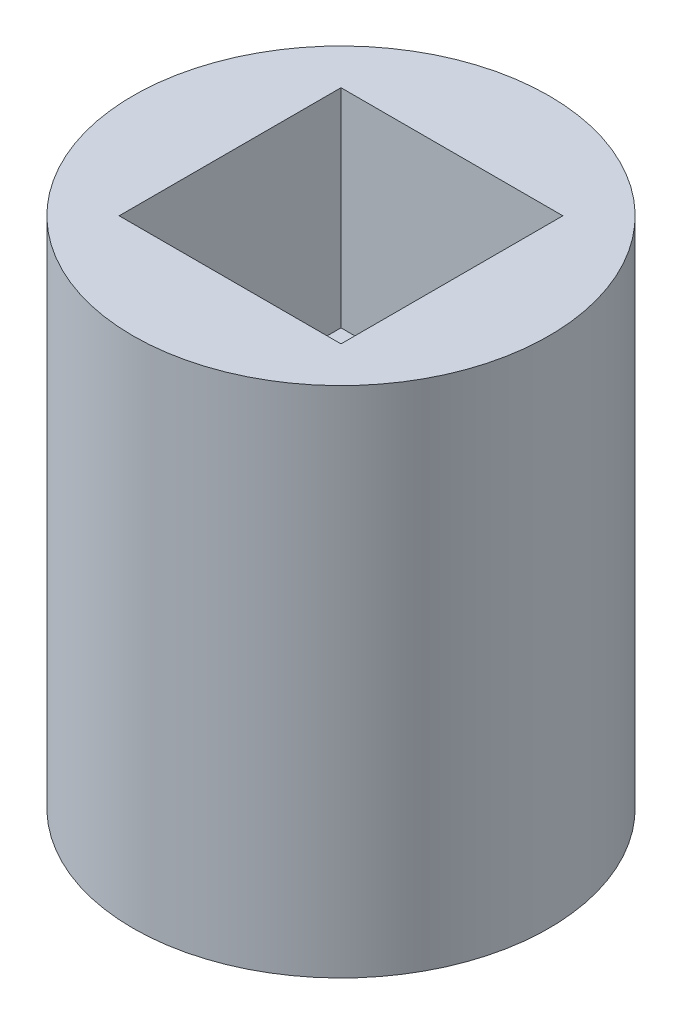
ISO-10303-21;
HEADER;
FILE_DESCRIPTION(('STEP AP214'),'2;1');
FILE_NAME('part.step','',(''),(''),'','','');
FILE_SCHEMA(('AUTOMOTIVE_DESIGN { 1 0 10303 214 1 1 1 1 }'));
ENDSEC;
DATA;
#1=APPLICATION_CONTEXT('core data for automotive mechanical design processes');
#2=APPLICATION_PROTOCOL_DEFINITION('international standard','automotive_design',2000,#1);
#3=PRODUCT_CONTEXT('',#1,'mechanical');
#4=PRODUCT('Part','Part','',(#3));
#5=PRODUCT_RELATED_PRODUCT_CATEGORY('part','',(#4));
#6=PRODUCT_DEFINITION_FORMATION('','',#4);
#7=PRODUCT_DEFINITION_CONTEXT('part definition',#1,'design');
#8=PRODUCT_DEFINITION('design','',#6,#7);
#9=PRODUCT_DEFINITION_SHAPE('','',#8);
#10=(LENGTH_UNIT() NAMED_UNIT(*) SI_UNIT(.MILLI.,.METRE.));
#11=(NAMED_UNIT(*) PLANE_ANGLE_UNIT() SI_UNIT($,.RADIAN.));
#12=(NAMED_UNIT(*) SI_UNIT($,.STERADIAN.) SOLID_ANGLE_UNIT());
#13=UNCERTAINTY_MEASURE_WITH_UNIT(LENGTH_MEASURE(1.E-05),#10,'distance_accuracy_value','');
#14=(GEOMETRIC_REPRESENTATION_CONTEXT(3) GLOBAL_UNCERTAINTY_ASSIGNED_CONTEXT((#13)) GLOBAL_UNIT_ASSIGNED_CONTEXT((#10,
#11,#12)) REPRESENTATION_CONTEXT('',''));
#15=CARTESIAN_POINT('',(0.,0.,0.));
#16=DIRECTION('',(0.,0.,1.));
#17=DIRECTION('',(1.,0.,0.));
#18=AXIS2_PLACEMENT_3D('',#15,#16,#17);
#19=CARTESIAN_POINT('',(0.,22.,0.));
#20=DIRECTION('',(0.,-1.,0.));
#21=DIRECTION('',(0.,0.,-1.));
#22=AXIS2_PLACEMENT_3D('',#19,#20,#21);
#23=CYLINDRICAL_SURFACE('',#22,15.);
#24=CARTESIAN_POINT('',(0.,0.,0.));
#25=DIRECTION('',(0.,1.,0.));
#26=DIRECTION('',(0.,0.,1.));
#27=AXIS2_PLACEMENT_3D('',#24,#25,#26);
#28=CIRCLE('',#27,15.);
#29=CARTESIAN_POINT('',(0.,0.,15.));
#30=VERTEX_POINT('',#29);
#31=EDGE_CURVE('E119',#30,#30,#28,.T.);
#32=ORIENTED_EDGE('',*,*,#31,.T.);
#33=EDGE_LOOP('',(#32));
#34=FACE_BOUND('',#33,.T.);
#35=CARTESIAN_POINT('',(0.,37.,0.));
#36=DIRECTION('',(0.,1.,0.));
#37=DIRECTION('',(0.,0.,1.));
#38=AXIS2_PLACEMENT_3D('',#35,#36,#37);
#39=CIRCLE('',#38,15.);
#40=CARTESIAN_POINT('',(0.,37.,15.));
#41=VERTEX_POINT('',#40);
#42=EDGE_CURVE('E114',#41,#41,#39,.T.);
#43=ORIENTED_EDGE('',*,*,#42,.F.);
#44=EDGE_LOOP('',(#43));
#45=FACE_BOUND('',#44,.T.);
#46=CARTESIAN_POINT('',(0.,9.,-15.));
#47=CARTESIAN_POINT('',(0.1667307203779,8.99999386650496,-14.9999969274261));
#48=CARTESIAN_POINT('',(0.333538980604567,8.98605347109706,-14.9971915553469));
#49=CARTESIAN_POINT('',(0.662440523067058,8.93070449965427,-14.9862709686969));
#50=CARTESIAN_POINT('',(0.824529952624067,8.88927410159547,-14.9781515358056));
#51=CARTESIAN_POINT('',(1.13919091578994,8.78027617913763,-14.9575094783486));
#52=CARTESIAN_POINT('',(1.2917714037994,8.71273368946594,-14.9449910723015));
#53=CARTESIAN_POINT('',(1.58342396659268,8.55350325746612,-14.9169119410594));
#54=CARTESIAN_POINT('',(1.72249684522743,8.46181675317838,-14.9013513970712));
#55=CARTESIAN_POINT('',(1.98508043194459,8.2555845171257,-14.8686649598991));
#56=CARTESIAN_POINT('',(2.10838185347557,8.14077493382639,-14.8515223651304));
#57=CARTESIAN_POINT('',(2.33411026982408,7.89212275082489,-14.8177254135777));
#58=CARTESIAN_POINT('',(2.43653563431127,7.75827866599464,-14.8010710950127));
#59=CARTESIAN_POINT('',(2.61849526004286,7.47385142096437,-14.7699732543785));
#60=CARTESIAN_POINT('',(2.6978128165976,7.32312706861092,-14.7555512209484));
#61=CARTESIAN_POINT('',(2.82991699974092,7.01015454298776,-14.7307880417525));
#62=CARTESIAN_POINT('',(2.88270624731171,6.84790750996096,-14.7204464928589));
#63=CARTESIAN_POINT('',(2.95957589965448,6.51874690827625,-14.7051841575661));
#64=CARTESIAN_POINT('',(2.98402349387633,6.35192236757332,-14.7001941032156));
#65=CARTESIAN_POINT('',(3.00465638317836,6.01647053590697,-14.6959912518188));
#66=CARTESIAN_POINT('',(3.0008445681405,5.84784343103956,-14.6967778640352));
#67=CARTESIAN_POINT('',(2.96536371930546,5.51625963593699,-14.7039765344455));
#68=CARTESIAN_POINT('',(2.93411562073172,5.35325578311806,-14.7103035857629));
#69=CARTESIAN_POINT('',(2.84531365386915,5.03485177001099,-14.7277363848));
#70=CARTESIAN_POINT('',(2.78775852930204,4.87945197324298,-14.7388423607334));
#71=CARTESIAN_POINT('',(2.64757435102416,4.5794542148892,-14.7646685550122));
#72=CARTESIAN_POINT('',(2.56477845369634,4.43493636129249,-14.7794126944111));
#73=CARTESIAN_POINT('',(2.37658072371804,4.16168745008156,-14.8108385631919));
#74=CARTESIAN_POINT('',(2.27117629307049,4.03295820944653,-14.827520515151));
#75=CARTESIAN_POINT('',(2.03849980368175,3.79251179262919,-14.8613106372439));
#76=CARTESIAN_POINT('',(1.91086848363733,3.68114229642261,-14.8784210763271));
#77=CARTESIAN_POINT('',(1.63855507218603,3.48133846109633,-14.9108654614323));
#78=CARTESIAN_POINT('',(1.49387276213817,3.39290441611926,-14.9261993846692));
#79=CARTESIAN_POINT('',(1.19117816063676,3.24141747232207,-14.9534007048266));
#80=CARTESIAN_POINT('',(1.0331454587559,3.17840431906639,-14.9652626654482));
#81=CARTESIAN_POINT('',(0.708446929345994,3.0799185778843,-14.9841422696357));
#82=CARTESIAN_POINT('',(0.541782150217348,3.04444265377912,-14.9911605000159));
#83=CARTESIAN_POINT('',(0.207538216881451,3.00253063861717,-14.999480156006));
#84=CARTESIAN_POINT('',(0.0400209849767288,2.99561874137919,-15.0008752395741));
#85=CARTESIAN_POINT('',(-0.293774802578142,3.00974957682654,-14.9980515579031));
#86=CARTESIAN_POINT('',(-0.460053427331379,3.03079073805779,-14.9938331082434));
#87=CARTESIAN_POINT('',(-0.785116979839622,3.09983512063187,-14.9803149602405));
#88=CARTESIAN_POINT('',(-0.943955845019709,3.14759420549371,-14.9710612921262));
#89=CARTESIAN_POINT('',(-1.251370882499,3.26845194796743,-14.948506561831));
#90=CARTESIAN_POINT('',(-1.39994628491262,3.34155250403049,-14.9352051964268));
#91=CARTESIAN_POINT('',(-1.68462352105865,3.51204747195394,-14.9057973459988));
#92=CARTESIAN_POINT('',(-1.82055038025656,3.60972834311684,-14.8896585131116));
#93=CARTESIAN_POINT('',(-2.07425405735762,3.82622757362184,-14.8564420448965));
#94=CARTESIAN_POINT('',(-2.19202892679229,3.9450481991996,-14.8393643090516));
#95=CARTESIAN_POINT('',(-2.40792177232253,4.20262005567337,-14.8058791067089));
#96=CARTESIAN_POINT('',(-2.50571310734597,4.34164723266401,-14.7894858069991));
#97=CARTESIAN_POINT('',(-2.67655626015362,4.63443408407004,-14.7595257538858));
#98=CARTESIAN_POINT('',(-2.74960906776871,4.78819316872066,-14.7459588874003));
#99=CARTESIAN_POINT('',(-2.86845552474588,5.10530473844865,-14.7233022175315));
#100=CARTESIAN_POINT('',(-2.91439049937315,5.26860252363096,-14.7141892461656));
#101=CARTESIAN_POINT('',(-2.97812595488159,5.60080036047272,-14.7014231037608));
#102=CARTESIAN_POINT('',(-2.99593010467534,5.76969967862804,-14.6977692207333));
#103=CARTESIAN_POINT('',(-3.0027627326024,6.10502659363296,-14.6963744889414));
#104=CARTESIAN_POINT('',(-2.99230736421269,6.27144344678103,-14.698527575679));
#105=CARTESIAN_POINT('',(-2.94405691230018,6.60009494971508,-14.7082672045384));
#106=CARTESIAN_POINT('',(-2.90626204838789,6.76232963308441,-14.7158537030151));
#107=CARTESIAN_POINT('',(-2.80463570549686,7.07768313372163,-14.7355579265748));
#108=CARTESIAN_POINT('',(-2.74086752015203,7.23082308150725,-14.7476646305649));
#109=CARTESIAN_POINT('',(-2.58916393380481,7.52431116220332,-14.7750514492251));
#110=CARTESIAN_POINT('',(-2.50122650632465,7.66465822117541,-14.7903318299668));
#111=CARTESIAN_POINT('',(-2.30191774435924,7.93114671645094,-14.8226688156968));
#112=CARTESIAN_POINT('',(-2.19017366170554,8.05700629580279,-14.839751187291));
#113=CARTESIAN_POINT('',(-1.94719310703942,8.28835861658751,-14.8735824561586));
#114=CARTESIAN_POINT('',(-1.81595216146,8.39384667095181,-14.8903312758955));
#115=CARTESIAN_POINT('',(-1.53605288726474,8.58250393183934,-14.9218149716391));
#116=CARTESIAN_POINT('',(-1.3872266532895,8.66542800984008,-14.9365269365774));
#117=CARTESIAN_POINT('',(-1.0774990828222,8.80495836778978,-14.96205375255));
#118=CARTESIAN_POINT('',(-0.916608782589379,8.86158836859748,-14.9728721141585));
#119=CARTESIAN_POINT('',(-0.629464466771339,8.93595584413415,-14.9872911778611));
#120=CARTESIAN_POINT('',(-0.504844992041354,8.95992958112327,-14.9920290947536));
#121=CARTESIAN_POINT('',(-0.253498575630201,8.99195373707509,-14.9983846241968));
#122=CARTESIAN_POINT('',(-0.126771701245857,9.0000046635293,-15.0000023361946));
#123=CARTESIAN_POINT('',(0.,9.,-15.));
#124=B_SPLINE_CURVE_WITH_KNOTS('',3,(#46,#47,#48,#49,#50,#51,#52,#53,#54,#55,#56,#57,#58,#59,
#60,#61,#62,#63,#64,#65,#66,#67,#68,#69,#70,#71,#72,#73,#74,#75,#76,#77,#78,#79,#80,#81,#82,#83,
#84,#85,#86,#87,#88,#89,#90,#91,#92,#93,#94,#95,#96,#97,#98,#99,#100,#101,#102,#103,#104,#105,
#106,#107,#108,#109,#110,#111,#112,#113,#114,#115,#116,#117,#118,#119,#120,#121,#122,#123),
.UNSPECIFIED.,.T.,.F.,(4,2,2,2,2,2,2,2,2,2,2,2,2,2,2,2,2,2,2,2,2,2,2,2,2,2,2,2,2,2,2,2,2,2,2,2,
2,2,4),(0.,0.499728391983775,0.999853952073968,1.49950120575102,1.99911870669259,
2.50479801033656,3.0105167902421,3.52083585017768,4.03110448095592,4.53468555310762,
5.03821512843675,5.53415181018835,6.03011217761189,6.52942470610778,7.02879464249011,
7.53714757474052,8.04550702619461,8.55465824562071,9.06374777094108,9.56432207028795,
10.064868229736,10.5609136185217,11.0569961764807,11.5591519810008,12.0613616503779,
12.5712188573768,13.081055661704,13.5882114309817,14.0953010499124,14.593191677031,
15.0910783047783,15.5877588375933,16.084481027456,16.5896422871743,17.0949196359879,
17.6054849002691,18.1155886655256,18.4955632586968,18.8755257411299),.UNSPECIFIED.);
#125=CARTESIAN_POINT('',(0.,9.,-15.));
#126=VERTEX_POINT('',#125);
#127=EDGE_CURVE('E138',#126,#126,#124,.T.);
#128=ORIENTED_EDGE('',*,*,#127,.F.);
#129=EDGE_LOOP('',(#128));
#130=FACE_BOUND('',#129,.T.);
#131=ADVANCED_FACE('F43',(#34,#45,#130),#23,.T.);
#132=CARTESIAN_POINT('',(0.,37.,-8.));
#133=DIRECTION('',(0.,0.,1.));
#134=DIRECTION('',(1.,0.,0.));
#135=AXIS2_PLACEMENT_3D('',#132,#133,#134);
#136=PLANE('',#135);
#137=DIRECTION('',(-1.,0.,0.));
#138=VECTOR('',#137,1.);
#139=CARTESIAN_POINT('',(0.,22.,-8.));
#140=LINE('',#139,#138);
#141=CARTESIAN_POINT('',(8.,22.,-8.));
#142=VERTEX_POINT('',#141);
#143=CARTESIAN_POINT('',(-8.,22.,-8.));
#144=VERTEX_POINT('',#143);
#145=EDGE_CURVE('E90',#142,#144,#140,.T.);
#146=ORIENTED_EDGE('',*,*,#145,.F.);
#147=DIRECTION('',(0.,-1.,0.));
#148=VECTOR('',#147,1.);
#149=CARTESIAN_POINT('',(8.,37.,-8.));
#150=LINE('',#149,#148);
#151=CARTESIAN_POINT('',(8.,37.,-8.));
#152=VERTEX_POINT('',#151);
#153=EDGE_CURVE('E84',#152,#142,#150,.T.);
#154=ORIENTED_EDGE('',*,*,#153,.F.);
#155=DIRECTION('',(-1.,0.,0.));
#156=VECTOR('',#155,1.);
#157=CARTESIAN_POINT('',(0.,37.,-8.));
#158=LINE('',#157,#156);
#159=CARTESIAN_POINT('',(-8.,37.,-8.));
#160=VERTEX_POINT('',#159);
#161=EDGE_CURVE('E88',#152,#160,#158,.T.);
#162=ORIENTED_EDGE('',*,*,#161,.T.);
#163=DIRECTION('',(0.,-1.,0.));
#164=VECTOR('',#163,1.);
#165=CARTESIAN_POINT('',(-8.,37.,-8.));
#166=LINE('',#165,#164);
#167=EDGE_CURVE('E117',#160,#144,#166,.T.);
#168=ORIENTED_EDGE('',*,*,#167,.T.);
#169=EDGE_LOOP('',(#146,#154,#162,#168));
#170=FACE_BOUND('',#169,.T.);
#171=ADVANCED_FACE('F86',(#170),#136,.T.);
#172=CARTESIAN_POINT('',(8.,37.,0.));
#173=DIRECTION('',(-1.,0.,0.));
#174=DIRECTION('',(0.,0.,1.));
#175=AXIS2_PLACEMENT_3D('',#172,#173,#174);
#176=PLANE('',#175);
#177=DIRECTION('',(0.,0.,-1.));
#178=VECTOR('',#177,1.);
#179=CARTESIAN_POINT('',(8.,22.,0.));
#180=LINE('',#179,#178);
#181=CARTESIAN_POINT('',(8.,22.,8.));
#182=VERTEX_POINT('',#181);
#183=EDGE_CURVE('E59',#182,#142,#180,.T.);
#184=ORIENTED_EDGE('',*,*,#183,.F.);
#185=DIRECTION('',(0.,-1.,0.));
#186=VECTOR('',#185,1.);
#187=CARTESIAN_POINT('',(8.,37.,8.));
#188=LINE('',#187,#186);
#189=CARTESIAN_POINT('',(8.,37.,8.));
#190=VERTEX_POINT('',#189);
#191=EDGE_CURVE('E94',#190,#182,#188,.T.);
#192=ORIENTED_EDGE('',*,*,#191,.F.);
#193=DIRECTION('',(0.,0.,-1.));
#194=VECTOR('',#193,1.);
#195=CARTESIAN_POINT('',(8.,37.,0.));
#196=LINE('',#195,#194);
#197=EDGE_CURVE('E101',#190,#152,#196,.T.);
#198=ORIENTED_EDGE('',*,*,#197,.T.);
#199=ORIENTED_EDGE('',*,*,#153,.T.);
#200=EDGE_LOOP('',(#184,#192,#198,#199));
#201=FACE_BOUND('',#200,.T.);
#202=ADVANCED_FACE('F107',(#201),#176,.T.);
#203=CARTESIAN_POINT('',(0.,37.,8.));
#204=DIRECTION('',(0.,0.,-1.));
#205=DIRECTION('',(-1.,0.,0.));
#206=AXIS2_PLACEMENT_3D('',#203,#204,#205);
#207=PLANE('',#206);
#208=DIRECTION('',(1.,0.,0.));
#209=VECTOR('',#208,1.);
#210=CARTESIAN_POINT('',(0.,22.,8.));
#211=LINE('',#210,#209);
#212=CARTESIAN_POINT('',(-8.,22.,8.));
#213=VERTEX_POINT('',#212);
#214=EDGE_CURVE('E64',#213,#182,#211,.T.);
#215=ORIENTED_EDGE('',*,*,#214,.F.);
#216=DIRECTION('',(0.,-1.,0.));
#217=VECTOR('',#216,1.);
#218=CARTESIAN_POINT('',(-8.,37.,8.));
#219=LINE('',#218,#217);
#220=CARTESIAN_POINT('',(-8.,37.,8.));
#221=VERTEX_POINT('',#220);
#222=EDGE_CURVE('E124',#221,#213,#219,.T.);
#223=ORIENTED_EDGE('',*,*,#222,.F.);
#224=DIRECTION('',(1.,0.,0.));
#225=VECTOR('',#224,1.);
#226=CARTESIAN_POINT('',(0.,37.,8.));
#227=LINE('',#226,#225);
#228=EDGE_CURVE('E108',#221,#190,#227,.T.);
#229=ORIENTED_EDGE('',*,*,#228,.T.);
#230=ORIENTED_EDGE('',*,*,#191,.T.);
#231=EDGE_LOOP('',(#215,#223,#229,#230));
#232=FACE_BOUND('',#231,.T.);
#233=ADVANCED_FACE('F161',(#232),#207,.T.);
#234=CARTESIAN_POINT('',(-8.,37.,0.));
#235=DIRECTION('',(1.,0.,0.));
#236=DIRECTION('',(0.,0.,-1.));
#237=AXIS2_PLACEMENT_3D('',#234,#235,#236);
#238=PLANE('',#237);
#239=DIRECTION('',(0.,0.,1.));
#240=VECTOR('',#239,1.);
#241=CARTESIAN_POINT('',(-8.,22.,0.));
#242=LINE('',#241,#240);
#243=EDGE_CURVE('E105',#144,#213,#242,.T.);
#244=ORIENTED_EDGE('',*,*,#243,.F.);
#245=ORIENTED_EDGE('',*,*,#167,.F.);
#246=DIRECTION('',(0.,0.,1.));
#247=VECTOR('',#246,1.);
#248=CARTESIAN_POINT('',(-8.,37.,0.));
#249=LINE('',#248,#247);
#250=EDGE_CURVE('E104',#160,#221,#249,.T.);
#251=ORIENTED_EDGE('',*,*,#250,.T.);
#252=ORIENTED_EDGE('',*,*,#222,.T.);
#253=EDGE_LOOP('',(#244,#245,#251,#252));
#254=FACE_BOUND('',#253,.T.);
#255=ADVANCED_FACE('F158',(#254),#238,.T.);
#256=CARTESIAN_POINT('',(0.,37.,0.));
#257=DIRECTION('',(0.,1.,0.));
#258=DIRECTION('',(0.,0.,1.));
#259=AXIS2_PLACEMENT_3D('',#256,#257,#258);
#260=PLANE('',#259);
#261=ORIENTED_EDGE('',*,*,#161,.F.);
#262=ORIENTED_EDGE('',*,*,#197,.F.);
#263=ORIENTED_EDGE('',*,*,#228,.F.);
#264=ORIENTED_EDGE('',*,*,#250,.F.);
#265=EDGE_LOOP('',(#261,#262,#263,#264));
#266=FACE_BOUND('',#265,.T.);
#267=ORIENTED_EDGE('',*,*,#42,.T.);
#268=EDGE_LOOP('',(#267));
#269=FACE_BOUND('',#268,.T.);
#270=ADVANCED_FACE('F98',(#266,#269),#260,.T.);
#271=CARTESIAN_POINT('',(0.,22.,0.));
#272=DIRECTION('',(0.,1.,0.));
#273=DIRECTION('',(0.,0.,1.));
#274=AXIS2_PLACEMENT_3D('',#271,#272,#273);
#275=PLANE('',#274);
#276=ORIENTED_EDGE('',*,*,#145,.T.);
#277=ORIENTED_EDGE('',*,*,#243,.T.);
#278=ORIENTED_EDGE('',*,*,#214,.T.);
#279=ORIENTED_EDGE('',*,*,#183,.T.);
#280=EDGE_LOOP('',(#276,#277,#278,#279));
#281=FACE_BOUND('',#280,.T.);
#282=ADVANCED_FACE('F157',(#281),#275,.T.);
#283=CARTESIAN_POINT('',(0.,20.,0.));
#284=DIRECTION('',(0.,1.,0.));
#285=DIRECTION('',(0.,0.,1.));
#286=AXIS2_PLACEMENT_3D('',#283,#284,#285);
#287=PLANE('',#286);
#288=CARTESIAN_POINT('',(0.,20.,0.));
#289=DIRECTION('',(0.,1.,0.));
#290=DIRECTION('',(0.,0.,1.));
#291=AXIS2_PLACEMENT_3D('',#288,#289,#290);
#292=CIRCLE('',#291,4.08);
#293=CARTESIAN_POINT('',(0.,20.,4.08));
#294=VERTEX_POINT('',#293);
#295=EDGE_CURVE('E93',#294,#294,#292,.T.);
#296=ORIENTED_EDGE('',*,*,#295,.F.);
#297=EDGE_LOOP('',(#296));
#298=FACE_BOUND('',#297,.T.);
#299=ADVANCED_FACE('F172',(#298),#287,.F.);
#300=CARTESIAN_POINT('',(0.,20.,0.));
#301=DIRECTION('',(0.,-1.,0.));
#302=DIRECTION('',(0.,0.,-1.));
#303=AXIS2_PLACEMENT_3D('',#300,#301,#302);
#304=CYLINDRICAL_SURFACE('',#303,4.08);
#305=CARTESIAN_POINT('',(0.,2.00000000000001,0.));
#306=DIRECTION('',(0.,1.,0.));
#307=DIRECTION('',(0.,0.,1.));
#308=AXIS2_PLACEMENT_3D('',#305,#306,#307);
#309=CIRCLE('',#308,4.08);
#310=CARTESIAN_POINT('',(0.,2.00000000000001,4.08));
#311=VERTEX_POINT('',#310);
#312=EDGE_CURVE('E12',#311,#311,#309,.F.);
#313=ORIENTED_EDGE('',*,*,#312,.T.);
#314=EDGE_LOOP('',(#313));
#315=FACE_BOUND('',#314,.T.);
#316=CARTESIAN_POINT('',(0.,7.,-4.08));
#317=CARTESIAN_POINT('',(-0.0552856547997542,6.9999983867913,-4.07999904347983));
#318=CARTESIAN_POINT('',(-0.110589555534757,6.99539980982697,-4.07886505229323));
#319=CARTESIAN_POINT('',(-0.219614662834146,6.97715314963307,-4.07445115531419));
#320=CARTESIAN_POINT('',(-0.273334914291993,6.9634997174594,-4.07116998113879));
#321=CARTESIAN_POINT('',(-0.377602361782475,6.92760595569325,-4.06282538785046));
#322=CARTESIAN_POINT('',(-0.428153206786484,6.90537571984249,-4.05776406434986));
#323=CARTESIAN_POINT('',(-0.524807827045831,6.85299434020044,-4.04639938836367));
#324=CARTESIAN_POINT('',(-0.570911494785674,6.82284300497329,-4.04009600586113));
#325=CARTESIAN_POINT('',(-0.658278602373472,6.75484284933657,-4.02679263865219));
#326=CARTESIAN_POINT('',(-0.699441165979951,6.71686645168514,-4.01978224338267));
#327=CARTESIAN_POINT('',(-0.774881192410737,6.63456744741953,-4.00592480242645));
#328=CARTESIAN_POINT('',(-0.809157906787017,6.59024415183376,-3.99907777456794));
#329=CARTESIAN_POINT('',(-0.870322802286245,6.49573243872969,-3.98621776392493));
#330=CARTESIAN_POINT('',(-0.897099041065044,6.44546961125411,-3.98021801919));
#331=CARTESIAN_POINT('',(-0.941783331345641,6.3409854865286,-3.96988334019597));
#332=CARTESIAN_POINT('',(-0.959692740334483,6.2867647966758,-3.96554815112083));
#333=CARTESIAN_POINT('',(-0.985792617817698,6.17701094023036,-3.95914027934841));
#334=CARTESIAN_POINT('',(-0.994164020645168,6.12152331236697,-3.95702553816323));
#335=CARTESIAN_POINT('',(-1.0015136798388,6.00989402325879,-3.95517204095308));
#336=CARTESIAN_POINT('',(-1.00049340146238,5.95375246540286,-3.95543291429293));
#337=CARTESIAN_POINT('',(-0.989233223961131,5.84378866219735,-3.95826331892893));
#338=CARTESIAN_POINT('',(-0.979208014049217,5.78994283401665,-3.96077908762752));
#339=CARTESIAN_POINT('',(-0.950564641296718,5.68472156014026,-3.96775025295701));
#340=CARTESIAN_POINT('',(-0.93194588752353,5.63334628459972,-3.97220578297384));
#341=CARTESIAN_POINT('',(-0.886458683931886,5.53394421935816,-3.98260438506355));
#342=CARTESIAN_POINT('',(-0.859511560446334,5.48595496626262,-3.98856153872951));
#343=CARTESIAN_POINT('',(-0.798187614570195,5.39510203004747,-4.001284107171));
#344=CARTESIAN_POINT('',(-0.763809538728831,5.35223921355064,-4.00804965822054));
#345=CARTESIAN_POINT('',(-0.687483454075776,5.27162457825554,-4.02185380084849));
#346=CARTESIAN_POINT('',(-0.645354036133195,5.23404472167323,-4.02889479781477));
#347=CARTESIAN_POINT('',(-0.555307342443611,5.16645152590993,-4.04228926986746));
#348=CARTESIAN_POINT('',(-0.507389903206721,5.13643840053465,-4.04864272552379));
#349=CARTESIAN_POINT('',(-0.406887887690359,5.08477095732548,-4.05997590688986));
#350=CARTESIAN_POINT('',(-0.354288876619671,5.0631436766307,-4.06495117464449));
#351=CARTESIAN_POINT('',(-0.246052936909819,5.02908544943293,-4.0729348966259));
#352=CARTESIAN_POINT('',(-0.190416568198986,5.01665281402906,-4.07594371204492));
#353=CARTESIAN_POINT('',(-0.0791562514197062,5.00159734306814,-4.07960240163141));
#354=CARTESIAN_POINT('',(-0.023565813401153,4.99874021557239,-4.08030860382261));
#355=CARTESIAN_POINT('',(0.0872986990105945,5.00227551250838,-4.07944250263915));
#356=CARTESIAN_POINT('',(0.142572800292214,5.00866713871708,-4.07787039589621));
#357=CARTESIAN_POINT('',(0.250427701094333,5.0303251621787,-4.07266033050999));
#358=CARTESIAN_POINT('',(0.303035562095997,5.04546455413544,-4.06905195282485));
#359=CARTESIAN_POINT('',(0.40496276355444,5.08404396739163,-4.06017546260761));
#360=CARTESIAN_POINT('',(0.454281778973715,5.10748480768502,-4.05490718632098));
#361=CARTESIAN_POINT('',(0.54916956477039,5.16246135471102,-4.0431596291389));
#362=CARTESIAN_POINT('',(0.594659247300956,5.19412934916776,-4.03666107883662));
#363=CARTESIAN_POINT('',(0.679762140580368,5.26449135733275,-4.02320555329373));
#364=CARTESIAN_POINT('',(0.719374376718402,5.30318653394284,-4.01624850229918));
#365=CARTESIAN_POINT('',(0.79255710617912,5.38759047305308,-4.00245863019095));
#366=CARTESIAN_POINT('',(0.825963559709865,5.43344280564575,-3.99563258095964));
#367=CARTESIAN_POINT('',(0.884606578775757,5.53024170118902,-3.98306090876456));
#368=CARTESIAN_POINT('',(0.909843509340779,5.5811880363967,-3.97731523753226));
#369=CARTESIAN_POINT('',(0.951244935809842,5.68645281423023,-3.96761709565957));
#370=CARTESIAN_POINT('',(0.96746315010903,5.74074910275634,-3.96365403484739));
#371=CARTESIAN_POINT('',(0.990511567845286,5.85140901064271,-3.95795786021989));
#372=CARTESIAN_POINT('',(0.997343729852572,5.90777219618639,-3.95622428118753));
#373=CARTESIAN_POINT('',(1.0013267882343,6.01929938540797,-3.95521782529742));
#374=CARTESIAN_POINT('',(0.998739488603125,6.07445359122475,-3.95587840306281));
#375=CARTESIAN_POINT('',(0.98455395604824,6.18351367881292,-3.95943252719893));
#376=CARTESIAN_POINT('',(0.97295589079418,6.23741958379309,-3.96232603202));
#377=CARTESIAN_POINT('',(0.941218445123814,6.34218087625406,-3.96998363481834));
#378=CARTESIAN_POINT('',(0.921126362137209,6.39305140223914,-3.97473736372992));
#379=CARTESIAN_POINT('',(0.873008973370271,6.49073499624691,-3.98558162486133));
#380=CARTESIAN_POINT('',(0.844982610117191,6.53754752233649,-3.99167233524837));
#381=CARTESIAN_POINT('',(0.780963650546934,6.62705567953935,-4.00469554437411));
#382=CARTESIAN_POINT('',(0.744788564849346,6.6696182930756,-4.01164535062783));
#383=CARTESIAN_POINT('',(0.665857058665794,6.74815422925953,-4.02549835366319));
#384=CARTESIAN_POINT('',(0.62309908642941,6.78412599388984,-4.03240153905357));
#385=CARTESIAN_POINT('',(0.531326922321229,6.84906153632276,-4.04552524495268));
#386=CARTESIAN_POINT('',(0.482217675489601,6.87789396682058,-4.0517319626332));
#387=CARTESIAN_POINT('',(0.379702464248775,6.92684803101193,-4.06261913205221));
#388=CARTESIAN_POINT('',(0.326299702015976,6.94697608640199,-4.06730070834025));
#389=CARTESIAN_POINT('',(0.227471334815952,6.97486162603411,-4.07389394134642));
#390=CARTESIAN_POINT('',(0.182528104133276,6.98426855100265,-4.07616824756087));
#391=CARTESIAN_POINT('',(0.0917273933069408,6.99683819073766,-4.07922162185727));
#392=CARTESIAN_POINT('',(0.0458699767780467,7.00000133846377,-4.0800007936156));
#393=CARTESIAN_POINT('',(0.,7.,-4.08));
#394=B_SPLINE_CURVE_WITH_KNOTS('',3,(#316,#317,#318,#319,#320,#321,#322,#323,#324,#325,#326,
#327,#328,#329,#330,#331,#332,#333,#334,#335,#336,#337,#338,#339,#340,#341,#342,#343,#344,#345,
#346,#347,#348,#349,#350,#351,#352,#353,#354,#355,#356,#357,#358,#359,#360,#361,#362,#363,#364,
#365,#366,#367,#368,#369,#370,#371,#372,#373,#374,#375,#376,#377,#378,#379,#380,#381,#382,#383,
#384,#385,#386,#387,#388,#389,#390,#391,#392,#393),.UNSPECIFIED.,.T.,.F.,(4,2,2,2,2,2,2,2,2,2,2,
2,2,2,2,2,2,2,2,2,2,2,2,2,2,2,2,2,2,2,2,2,2,2,2,2,2,2,4),(0.,0.165688900800911,
0.331475765733713,0.497068114107193,0.662664464858408,0.831211309642141,0.999776464495763,
1.17073753473324,1.34167242320518,1.50930770298906,1.67691682934337,1.84063299531574,
2.00436042086143,2.16968437722426,2.33503624217397,2.50491301045008,2.67479457823009,
2.84521940187824,3.01561291358734,3.181805581933,3.34798390770777,3.51180810275647,
3.67564846467269,3.84230667309672,4.00899248633215,4.17959927475914,4.35019843909673,
4.51977026698144,4.68930670524833,4.85416748131368,5.01902518977216,5.18297676362077,
5.34695019906279,5.51504421356169,5.68317791284986,5.85420693808554,6.02510956964151,
6.16258959277692,6.30006008235773),.UNSPECIFIED.);
#395=CARTESIAN_POINT('',(0.,7.,-4.08));
#396=VERTEX_POINT('',#395);
#397=EDGE_CURVE('E130',#396,#396,#394,.T.);
#398=ORIENTED_EDGE('',*,*,#397,.F.);
#399=EDGE_LOOP('',(#398));
#400=FACE_BOUND('',#399,.T.);
#401=ORIENTED_EDGE('',*,*,#295,.T.);
#402=EDGE_LOOP('',(#401));
#403=FACE_BOUND('',#402,.T.);
#404=ADVANCED_FACE('F144',(#315,#400,#403),#304,.F.);
#405=CARTESIAN_POINT('',(0.,0.,0.));
#406=DIRECTION('',(0.,1.,0.));
#407=DIRECTION('',(0.,0.,1.));
#408=AXIS2_PLACEMENT_3D('',#405,#406,#407);
#409=PLANE('',#408);
#410=CARTESIAN_POINT('',(0.,0.,0.));
#411=DIRECTION('',(0.,1.,0.));
#412=DIRECTION('',(0.,0.,1.));
#413=AXIS2_PLACEMENT_3D('',#410,#411,#412);
#414=CIRCLE('',#413,6.08);
#415=CARTESIAN_POINT('',(0.,0.,6.08));
#416=VERTEX_POINT('',#415);
#417=EDGE_CURVE('E52',#416,#416,#414,.T.);
#418=ORIENTED_EDGE('',*,*,#417,.T.);
#419=EDGE_LOOP('',(#418));
#420=FACE_BOUND('',#419,.T.);
#421=ORIENTED_EDGE('',*,*,#31,.F.);
#422=EDGE_LOOP('',(#421));
#423=FACE_BOUND('',#422,.T.);
#424=ADVANCED_FACE('F151',(#420,#423),#409,.F.);
#425=CARTESIAN_POINT('',(0.,6.,-24.));
#426=DIRECTION('',(0.,0.,1.));
#427=DIRECTION('',(1.,0.,0.));
#428=AXIS2_PLACEMENT_3D('',#425,#426,#427);
#429=CYLINDRICAL_SURFACE('',#428,1.);
#430=CARTESIAN_POINT('',(0.,6.,-6.49999999999999));
#431=DIRECTION('',(0.,0.,1.));
#432=DIRECTION('',(1.,0.,0.));
#433=AXIS2_PLACEMENT_3D('',#430,#431,#432);
#434=CIRCLE('',#433,0.999999999999999);
#435=CARTESIAN_POINT('',(0.999999999999999,6.,-6.49999999999999));
#436=VERTEX_POINT('',#435);
#437=EDGE_CURVE('E190',#436,#436,#434,.T.);
#438=ORIENTED_EDGE('',*,*,#437,.F.);
#439=EDGE_LOOP('',(#438));
#440=FACE_BOUND('',#439,.T.);
#441=ORIENTED_EDGE('',*,*,#397,.T.);
#442=EDGE_LOOP('',(#441));
#443=FACE_BOUND('',#442,.T.);
#444=ADVANCED_FACE('F146',(#440,#443),#429,.F.);
#445=CARTESIAN_POINT('',(0.,6.,-6.49999999999999));
#446=DIRECTION('',(0.,0.,-1.));
#447=DIRECTION('',(-1.,0.,0.));
#448=AXIS2_PLACEMENT_3D('',#445,#446,#447);
#449=CYLINDRICAL_SURFACE('',#448,3.);
#450=CARTESIAN_POINT('',(0.,6.,-6.49999999999999));
#451=DIRECTION('',(0.,0.,1.));
#452=DIRECTION('',(1.,0.,0.));
#453=AXIS2_PLACEMENT_3D('',#450,#451,#452);
#454=CIRCLE('',#453,3.);
#455=CARTESIAN_POINT('',(3.,6.,-6.49999999999999));
#456=VERTEX_POINT('',#455);
#457=EDGE_CURVE('E188',#456,#456,#454,.T.);
#458=ORIENTED_EDGE('',*,*,#457,.T.);
#459=EDGE_LOOP('',(#458));
#460=FACE_BOUND('',#459,.T.);
#461=ORIENTED_EDGE('',*,*,#127,.T.);
#462=EDGE_LOOP('',(#461));
#463=FACE_BOUND('',#462,.T.);
#464=ADVANCED_FACE('F150',(#460,#463),#449,.F.);
#465=CARTESIAN_POINT('',(0.,6.,-6.49999999999999));
#466=DIRECTION('',(0.,0.,1.));
#467=DIRECTION('',(1.,0.,0.));
#468=AXIS2_PLACEMENT_3D('',#465,#466,#467);
#469=PLANE('',#468);
#470=ORIENTED_EDGE('',*,*,#457,.F.);
#471=EDGE_LOOP('',(#470));
#472=FACE_BOUND('',#471,.T.);
#473=ORIENTED_EDGE('',*,*,#437,.T.);
#474=EDGE_LOOP('',(#473));
#475=FACE_BOUND('',#474,.T.);
#476=ADVANCED_FACE('F198',(#472,#475),#469,.F.);
#477=CARTESIAN_POINT('',(0.,0.,0.));
#478=DIRECTION('',(0.,-1.,0.));
#479=DIRECTION('',(0.,0.,-1.));
#480=AXIS2_PLACEMENT_3D('',#477,#478,#479);
#481=CONICAL_SURFACE('',#480,6.08,0.785398163397447);
#482=ORIENTED_EDGE('',*,*,#312,.F.);
#483=EDGE_LOOP('',(#482));
#484=FACE_BOUND('',#483,.T.);
#485=ORIENTED_EDGE('',*,*,#417,.F.);
#486=EDGE_LOOP('',(#485));
#487=FACE_BOUND('',#486,.T.);
#488=ADVANCED_FACE('F46',(#484,#487),#481,.F.);
#489=CLOSED_SHELL('',(#131,#171,#202,#233,#255,#270,#282,#299,#404,#424,#444,#464,#476,#488));
#490=MANIFOLD_SOLID_BREP('B2',#489);
#491=ADVANCED_BREP_SHAPE_REPRESENTATION('',(#18,#490),#14);
#492=SHAPE_DEFINITION_REPRESENTATION(#9,#491);
ENDSEC;
END-ISO-10303-21;
